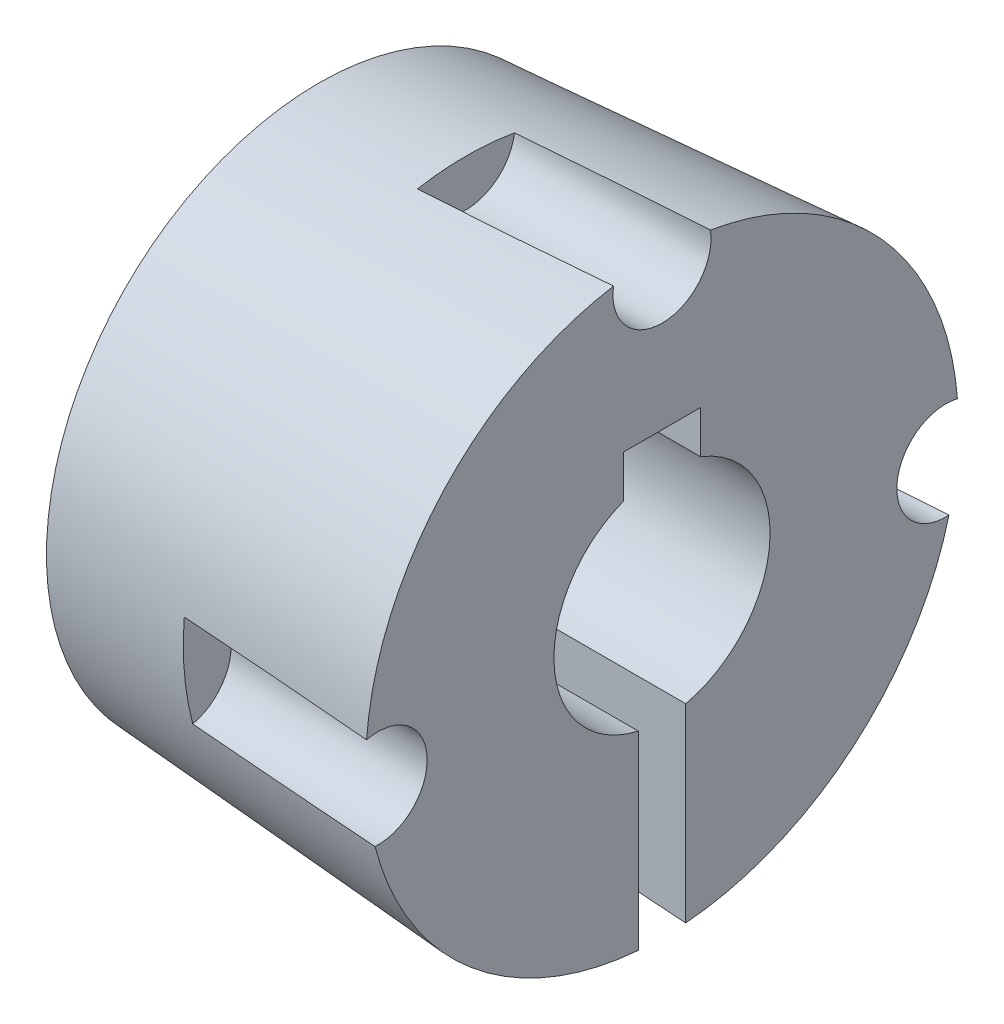
ISO-10303-21;
HEADER;
FILE_DESCRIPTION(('STEP AP214'),'2;1');
FILE_NAME('part.step','',(''),(''),'','','');
FILE_SCHEMA(('AUTOMOTIVE_DESIGN { 1 0 10303 214 1 1 1 1 }'));
ENDSEC;
DATA;
#1=APPLICATION_CONTEXT('core data for automotive mechanical design processes');
#2=APPLICATION_PROTOCOL_DEFINITION('international standard','automotive_design',2000,#1);
#3=PRODUCT_CONTEXT('',#1,'mechanical');
#4=PRODUCT('Part','Part','',(#3));
#5=PRODUCT_RELATED_PRODUCT_CATEGORY('part','',(#4));
#6=PRODUCT_DEFINITION_FORMATION('','',#4);
#7=PRODUCT_DEFINITION_CONTEXT('part definition',#1,'design');
#8=PRODUCT_DEFINITION('design','',#6,#7);
#9=PRODUCT_DEFINITION_SHAPE('','',#8);
#10=(LENGTH_UNIT() NAMED_UNIT(*) SI_UNIT(.MILLI.,.METRE.));
#11=(NAMED_UNIT(*) PLANE_ANGLE_UNIT() SI_UNIT($,.RADIAN.));
#12=(NAMED_UNIT(*) SI_UNIT($,.STERADIAN.) SOLID_ANGLE_UNIT());
#13=UNCERTAINTY_MEASURE_WITH_UNIT(LENGTH_MEASURE(1.E-05),#10,'distance_accuracy_value','');
#14=(GEOMETRIC_REPRESENTATION_CONTEXT(3) GLOBAL_UNCERTAINTY_ASSIGNED_CONTEXT((#13)) GLOBAL_UNIT_ASSIGNED_CONTEXT((#10,
#11,#12)) REPRESENTATION_CONTEXT('',''));
#15=CARTESIAN_POINT('',(0.,0.,0.));
#16=DIRECTION('',(0.,0.,1.));
#17=DIRECTION('',(1.,0.,0.));
#18=AXIS2_PLACEMENT_3D('',#15,#16,#17);
#19=CARTESIAN_POINT('',(22.225,9.59485,0.));
#20=DIRECTION('',(1.,0.,0.));
#21=DIRECTION('',(0.,-1.,0.));
#22=AXIS2_PLACEMENT_3D('',#19,#20,#21);
#23=PLANE('',#22);
#24=DIRECTION('',(0.,1.,0.));
#25=VECTOR('',#24,1.);
#26=CARTESIAN_POINT('',(22.225,-0.959485,1.535176));
#27=LINE('',#26,#25);
#28=CARTESIAN_POINT('',(22.225,-19.1281943930687,1.535176));
#29=VERTEX_POINT('',#28);
#30=CARTESIAN_POINT('',(22.225,-6.82958524721846,1.535176));
#31=VERTEX_POINT('',#30);
#32=EDGE_CURVE('E132',#29,#31,#27,.T.);
#33=ORIENTED_EDGE('',*,*,#32,.T.);
#34=CARTESIAN_POINT('',(22.225,0.,0.));
#35=DIRECTION('',(-1.,0.,0.));
#36=DIRECTION('',(0.,0.,-1.));
#37=AXIS2_PLACEMENT_3D('',#34,#35,#36);
#38=CIRCLE('',#37,7.);
#39=CARTESIAN_POINT('',(22.225,6.53834841531101,2.5));
#40=VERTEX_POINT('',#39);
#41=EDGE_CURVE('E168',#31,#40,#38,.T.);
#42=ORIENTED_EDGE('',*,*,#41,.T.);
#43=DIRECTION('',(0.,1.,0.));
#44=VECTOR('',#43,1.);
#45=CARTESIAN_POINT('',(22.225,7.122425,2.5));
#46=LINE('',#45,#44);
#47=CARTESIAN_POINT('',(22.225,9.3,2.5));
#48=VERTEX_POINT('',#47);
#49=EDGE_CURVE('E173',#40,#48,#46,.T.);
#50=ORIENTED_EDGE('',*,*,#49,.T.);
#51=DIRECTION('',(0.,0.,-1.));
#52=VECTOR('',#51,1.);
#53=CARTESIAN_POINT('',(22.225,9.3,0.));
#54=LINE('',#53,#52);
#55=CARTESIAN_POINT('',(22.225,9.3,-2.5));
#56=VERTEX_POINT('',#55);
#57=EDGE_CURVE('E11',#48,#56,#54,.T.);
#58=ORIENTED_EDGE('',*,*,#57,.T.);
#59=DIRECTION('',(0.,-1.,0.));
#60=VECTOR('',#59,1.);
#61=CARTESIAN_POINT('',(22.225,7.122425,-2.5));
#62=LINE('',#61,#60);
#63=CARTESIAN_POINT('',(22.225,6.53834841531101,-2.5));
#64=VERTEX_POINT('',#63);
#65=EDGE_CURVE('E160',#56,#64,#62,.T.);
#66=ORIENTED_EDGE('',*,*,#65,.T.);
#67=CARTESIAN_POINT('',(22.225,0.,0.));
#68=DIRECTION('',(-1.,0.,0.));
#69=DIRECTION('',(0.,0.,-1.));
#70=AXIS2_PLACEMENT_3D('',#67,#68,#69);
#71=CIRCLE('',#70,7.);
#72=CARTESIAN_POINT('',(22.225,-6.82958524721846,-1.535176));
#73=VERTEX_POINT('',#72);
#74=EDGE_CURVE('E180',#64,#73,#71,.T.);
#75=ORIENTED_EDGE('',*,*,#74,.T.);
#76=DIRECTION('',(0.,-1.,0.));
#77=VECTOR('',#76,1.);
#78=CARTESIAN_POINT('',(22.225,-0.959485,-1.535176));
#79=LINE('',#78,#77);
#80=CARTESIAN_POINT('',(22.225,-19.1281943930687,-1.535176));
#81=VERTEX_POINT('',#80);
#82=EDGE_CURVE('E166',#73,#81,#79,.T.);
#83=ORIENTED_EDGE('',*,*,#82,.T.);
#84=CARTESIAN_POINT('',(22.225,0.,0.));
#85=DIRECTION('',(-1.,0.,0.));
#86=DIRECTION('',(0.,1.,0.));
#87=AXIS2_PLACEMENT_3D('',#84,#85,#86);
#88=CIRCLE('',#87,19.1897);
#89=CARTESIAN_POINT('',(22.225,-4.77681167054719,-18.5856572752788));
#90=VERTEX_POINT('',#89);
#91=EDGE_CURVE('E218',#90,#81,#88,.T.);
#92=ORIENTED_EDGE('',*,*,#91,.F.);
#93=CARTESIAN_POINT('',(22.225,-1.60829363649681,-18.3828803833568));
#94=DIRECTION('',(-1.,0.,0.));
#95=DIRECTION('',(0.,-0.996194698091746,0.0871557427476582));
#96=AXIS2_PLACEMENT_3D('',#93,#94,#95);
#97=CIRCLE('',#96,3.175);
#98=CARTESIAN_POINT('',(22.225,1.47687565123978,-19.1327840211709));
#99=VERTEX_POINT('',#98);
#100=EDGE_CURVE('E247',#90,#99,#97,.T.);
#101=ORIENTED_EDGE('',*,*,#100,.T.);
#102=CARTESIAN_POINT('',(22.225,0.,0.));
#103=DIRECTION('',(-1.,0.,0.));
#104=DIRECTION('',(0.,1.,0.));
#105=AXIS2_PLACEMENT_3D('',#102,#103,#104);
#106=CIRCLE('',#105,19.1897);
#107=CARTESIAN_POINT('',(22.225,18.9312598072953,-3.13878769570155));
#108=VERTEX_POINT('',#107);
#109=EDGE_CURVE('E216',#108,#99,#106,.T.);
#110=ORIENTED_EDGE('',*,*,#109,.F.);
#111=CARTESIAN_POINT('',(22.225,18.4531,0.));
#112=DIRECTION('',(-1.,0.,0.));
#113=DIRECTION('',(0.,0.,-1.));
#114=AXIS2_PLACEMENT_3D('',#111,#112,#113);
#115=CIRCLE('',#114,3.175);
#116=CARTESIAN_POINT('',(22.225,18.9312598072953,3.13878769570155));
#117=VERTEX_POINT('',#116);
#118=EDGE_CURVE('E179',#108,#117,#115,.T.);
#119=ORIENTED_EDGE('',*,*,#118,.T.);
#120=CARTESIAN_POINT('',(22.225,0.,0.));
#121=DIRECTION('',(-1.,0.,0.));
#122=DIRECTION('',(0.,1.,0.));
#123=AXIS2_PLACEMENT_3D('',#120,#121,#122);
#124=CIRCLE('',#123,19.1897);
#125=CARTESIAN_POINT('',(22.225,1.47687565123978,19.1327840211709));
#126=VERTEX_POINT('',#125);
#127=EDGE_CURVE('E209',#126,#117,#124,.T.);
#128=ORIENTED_EDGE('',*,*,#127,.F.);
#129=CARTESIAN_POINT('',(22.225,-1.60829363649681,18.3828803833568));
#130=DIRECTION('',(-1.,0.,0.));
#131=DIRECTION('',(0.,0.996194698091746,0.0871557427476582));
#132=AXIS2_PLACEMENT_3D('',#129,#130,#131);
#133=CIRCLE('',#132,3.175);
#134=CARTESIAN_POINT('',(22.225,-4.77681167054719,18.5856572752788));
#135=VERTEX_POINT('',#134);
#136=EDGE_CURVE('E135',#126,#135,#133,.T.);
#137=ORIENTED_EDGE('',*,*,#136,.T.);
#138=CARTESIAN_POINT('',(22.225,0.,0.));
#139=DIRECTION('',(-1.,0.,0.));
#140=DIRECTION('',(0.,1.,0.));
#141=AXIS2_PLACEMENT_3D('',#138,#139,#140);
#142=CIRCLE('',#141,19.1897);
#143=EDGE_CURVE('E129',#29,#135,#142,.T.);
#144=ORIENTED_EDGE('',*,*,#143,.F.);
#145=EDGE_LOOP('',(#33,#42,#50,#58,#66,#75,#83,#92,#101,#110,#119,#128,#137,#144));
#146=FACE_BOUND('',#145,.T.);
#147=ADVANCED_FACE('F19',(#146),#23,.T.);
#148=CARTESIAN_POINT('',(11.1125,9.3,0.));
#149=DIRECTION('',(0.,-1.,0.));
#150=DIRECTION('',(0.,0.,-1.));
#151=AXIS2_PLACEMENT_3D('',#148,#149,#150);
#152=PLANE('',#151);
#153=DIRECTION('',(0.,0.,1.));
#154=VECTOR('',#153,1.);
#155=CARTESIAN_POINT('',(0.,9.3,0.));
#156=LINE('',#155,#154);
#157=CARTESIAN_POINT('',(0.,9.3,-2.5));
#158=VERTEX_POINT('',#157);
#159=CARTESIAN_POINT('',(0.,9.3,2.5));
#160=VERTEX_POINT('',#159);
#161=EDGE_CURVE('E176',#158,#160,#156,.T.);
#162=ORIENTED_EDGE('',*,*,#161,.F.);
#163=DIRECTION('',(1.,0.,0.));
#164=VECTOR('',#163,1.);
#165=CARTESIAN_POINT('',(11.1125,9.3,-2.5));
#166=LINE('',#165,#164);
#167=EDGE_CURVE('E31',#158,#56,#166,.T.);
#168=ORIENTED_EDGE('',*,*,#167,.T.);
#169=ORIENTED_EDGE('',*,*,#57,.F.);
#170=DIRECTION('',(-1.,0.,0.));
#171=VECTOR('',#170,1.);
#172=CARTESIAN_POINT('',(11.1125,9.3,2.5));
#173=LINE('',#172,#171);
#174=EDGE_CURVE('E177',#48,#160,#173,.T.);
#175=ORIENTED_EDGE('',*,*,#174,.T.);
#176=EDGE_LOOP('',(#162,#168,#169,#175));
#177=FACE_BOUND('',#176,.T.);
#178=ADVANCED_FACE('F371',(#177),#152,.T.);
#179=CARTESIAN_POINT('',(11.1125,4.65,-2.5));
#180=DIRECTION('',(0.,0.,1.));
#181=DIRECTION('',(1.,0.,0.));
#182=AXIS2_PLACEMENT_3D('',#179,#180,#181);
#183=PLANE('',#182);
#184=DIRECTION('',(0.,1.,0.));
#185=VECTOR('',#184,1.);
#186=CARTESIAN_POINT('',(0.,6.73452557374426,-2.5));
#187=LINE('',#186,#185);
#188=CARTESIAN_POINT('',(0.,6.53834841531101,-2.5));
#189=VERTEX_POINT('',#188);
#190=EDGE_CURVE('E163',#189,#158,#187,.T.);
#191=ORIENTED_EDGE('',*,*,#190,.F.);
#192=DIRECTION('',(-1.,0.,0.));
#193=VECTOR('',#192,1.);
#194=CARTESIAN_POINT('',(11.1125,6.53834841531101,-2.5));
#195=LINE('',#194,#193);
#196=EDGE_CURVE('E98',#64,#189,#195,.T.);
#197=ORIENTED_EDGE('',*,*,#196,.F.);
#198=ORIENTED_EDGE('',*,*,#65,.F.);
#199=ORIENTED_EDGE('',*,*,#167,.F.);
#200=EDGE_LOOP('',(#191,#197,#198,#199));
#201=FACE_BOUND('',#200,.T.);
#202=ADVANCED_FACE('F376',(#201),#183,.T.);
#203=CARTESIAN_POINT('',(11.1125,4.65,2.5));
#204=DIRECTION('',(0.,0.,1.));
#205=DIRECTION('',(1.,0.,0.));
#206=AXIS2_PLACEMENT_3D('',#203,#204,#205);
#207=PLANE('',#206);
#208=DIRECTION('',(0.,-1.,0.));
#209=VECTOR('',#208,1.);
#210=CARTESIAN_POINT('',(0.,6.73452557374426,2.5));
#211=LINE('',#210,#209);
#212=CARTESIAN_POINT('',(0.,6.53834841531101,2.5));
#213=VERTEX_POINT('',#212);
#214=EDGE_CURVE('E188',#160,#213,#211,.T.);
#215=ORIENTED_EDGE('',*,*,#214,.F.);
#216=ORIENTED_EDGE('',*,*,#174,.F.);
#217=ORIENTED_EDGE('',*,*,#49,.F.);
#218=DIRECTION('',(1.,0.,0.));
#219=VECTOR('',#218,1.);
#220=CARTESIAN_POINT('',(11.1125,6.53834841531101,2.5));
#221=LINE('',#220,#219);
#222=EDGE_CURVE('E171',#213,#40,#221,.T.);
#223=ORIENTED_EDGE('',*,*,#222,.F.);
#224=EDGE_LOOP('',(#215,#216,#217,#223));
#225=FACE_BOUND('',#224,.T.);
#226=ADVANCED_FACE('F350',(#225),#207,.F.);
#227=CARTESIAN_POINT('',(16.375,18.4531,0.));
#228=DIRECTION('',(-1.,0.,0.));
#229=DIRECTION('',(0.,0.,-1.));
#230=AXIS2_PLACEMENT_3D('',#227,#228,#229);
#231=CYLINDRICAL_SURFACE('',#230,3.175);
#232=CARTESIAN_POINT('',(22.2249990842214,18.9312663694617,3.13874772556863));
#233=CARTESIAN_POINT('',(21.6965128717116,18.8929039142587,3.14455795965913));
#234=CARTESIAN_POINT('',(21.1680111110432,18.8546480942142,3.14965156892552));
#235=CARTESIAN_POINT('',(20.110817453753,18.7783407807485,3.15843144485977));
#236=CARTESIAN_POINT('',(19.5821255487172,18.7402893539092,3.1621172774578));
#237=CARTESIAN_POINT('',(18.5245516279835,18.6643935701948,3.16810490022839));
#238=CARTESIAN_POINT('',(17.995669604871,18.6265492823395,3.1704062539587));
#239=CARTESIAN_POINT('',(16.9377154395597,18.5510693455787,3.17364806457086));
#240=CARTESIAN_POINT('',(16.4086432909538,18.5134337677394,3.17458808323553));
#241=CARTESIAN_POINT('',(15.3503088758068,18.4383720006973,3.17513025511628));
#242=CARTESIAN_POINT('',(14.8210466038835,18.4009458843075,3.17473196892807));
#243=CARTESIAN_POINT('',(13.7623319385705,18.3263028869355,3.17262043290532));
#244=CARTESIAN_POINT('',(13.2328795408319,18.2890860801693,3.17090674304027));
#245=CARTESIAN_POINT('',(12.1737846294268,18.2148607661589,3.16618718775157));
#246=CARTESIAN_POINT('',(11.6441421124536,18.1778523342146,3.1631808822157));
#247=CARTESIAN_POINT('',(10.5846669364506,18.104041794008,3.15589872208468));
#248=CARTESIAN_POINT('',(10.0548342751476,18.0672397617076,3.15162242780242));
#249=CARTESIAN_POINT('',(9.52499991031494,18.0305463707409,3.14672354499309));
#250=B_SPLINE_CURVE_WITH_KNOTS('',3,(#232,#233,#234,#235,#236,#237,#238,#239,#240,#241,#242,
#243,#244,#245,#246,#247,#248,#249),.UNSPECIFIED.,.F.,.F.,(4,2,2,2,2,2,2,2,4),(0.,
1.5897251702087,3.17994011676524,4.77065609934622,6.36188402365459,7.95363444524772,
9.54591757338986,11.1387432749278,12.7321210781888),.UNSPECIFIED.);
#251=CARTESIAN_POINT('',(9.525,18.0305408396218,3.14675527424369));
#252=VERTEX_POINT('',#251);
#253=EDGE_CURVE('E212',#117,#252,#250,.T.);
#254=ORIENTED_EDGE('',*,*,#253,.F.);
#255=ORIENTED_EDGE('',*,*,#118,.F.);
#256=CARTESIAN_POINT('',(9.52499991031494,18.0305463707409,-3.14672354499308));
#257=CARTESIAN_POINT('',(10.0548342751476,18.0672397617076,-3.15162242780242));
#258=CARTESIAN_POINT('',(10.5846669364506,18.104041794008,-3.15589872208468));
#259=CARTESIAN_POINT('',(11.6441421124535,18.1778523342145,-3.16318088221571));
#260=CARTESIAN_POINT('',(12.1737846294267,18.2148607661589,-3.16618718775157));
#261=CARTESIAN_POINT('',(13.2328795408318,18.2890860801693,-3.17090674304027));
#262=CARTESIAN_POINT('',(13.7623319385704,18.3263028869355,-3.17262043290533));
#263=CARTESIAN_POINT('',(14.8210466038834,18.4009458843075,-3.17473196892808));
#264=CARTESIAN_POINT('',(15.3503088758067,18.4383720006973,-3.17513025511628));
#265=CARTESIAN_POINT('',(16.4086432909537,18.5134337677394,-3.17458808323554));
#266=CARTESIAN_POINT('',(16.9377154395596,18.5510693455787,-3.17364806457086));
#267=CARTESIAN_POINT('',(17.9956696048709,18.6265492823395,-3.1704062539587));
#268=CARTESIAN_POINT('',(18.5245516279834,18.6643935701948,-3.16810490022839));
#269=CARTESIAN_POINT('',(19.5821255487171,18.7402893539092,-3.16211727745779));
#270=CARTESIAN_POINT('',(20.110817453753,18.7783407807485,-3.15843144485975));
#271=CARTESIAN_POINT('',(21.1680111110432,18.8546480942142,-3.14965156892549));
#272=CARTESIAN_POINT('',(21.6965128717116,18.8929039142587,-3.14455795965909));
#273=CARTESIAN_POINT('',(22.2249990842214,18.9312663694617,-3.1387477255686));
#274=B_SPLINE_CURVE_WITH_KNOTS('',3,(#256,#257,#258,#259,#260,#261,#262,#263,#264,#265,#266,
#267,#268,#269,#270,#271,#272,#273),.UNSPECIFIED.,.F.,.F.,(4,2,2,2,2,2,2,2,4),(0.,
1.59337780326089,3.18620350479883,4.77848663294095,6.37023705453407,7.96146497884245,
9.55218096142345,11.14239590798,12.7321210781888),.UNSPECIFIED.);
#275=CARTESIAN_POINT('',(9.525,18.0305408396218,-3.14675527424369));
#276=VERTEX_POINT('',#275);
#277=EDGE_CURVE('E219',#276,#108,#274,.T.);
#278=ORIENTED_EDGE('',*,*,#277,.F.);
#279=CARTESIAN_POINT('',(9.525,18.4531,0.));
#280=DIRECTION('',(-1.,0.,0.));
#281=DIRECTION('',(0.,0.,-1.));
#282=AXIS2_PLACEMENT_3D('',#279,#280,#281);
#283=CIRCLE('',#282,3.175);
#284=EDGE_CURVE('E206',#276,#252,#283,.T.);
#285=ORIENTED_EDGE('',*,*,#284,.T.);
#286=EDGE_LOOP('',(#254,#255,#278,#285));
#287=FACE_BOUND('',#286,.T.);
#288=ADVANCED_FACE('F380',(#287),#231,.F.);
#289=CARTESIAN_POINT('',(9.525,18.4531,0.));
#290=DIRECTION('',(-1.,0.,0.));
#291=DIRECTION('',(0.,0.,1.));
#292=AXIS2_PLACEMENT_3D('',#289,#290,#291);
#293=PLANE('',#292);
#294=CARTESIAN_POINT('',(9.525,0.,0.));
#295=DIRECTION('',(-1.,0.,0.));
#296=DIRECTION('',(0.,1.,0.));
#297=AXIS2_PLACEMENT_3D('',#294,#295,#296);
#298=CIRCLE('',#297,18.3030727399869);
#299=EDGE_CURVE('E225',#252,#276,#298,.T.);
#300=ORIENTED_EDGE('',*,*,#299,.F.);
#301=ORIENTED_EDGE('',*,*,#284,.F.);
#302=EDGE_LOOP('',(#300,#301));
#303=FACE_BOUND('',#302,.T.);
#304=ADVANCED_FACE('F347',(#303),#293,.F.);
#305=CARTESIAN_POINT('',(16.375,-1.60829363649681,18.3828803833568));
#306=DIRECTION('',(-1.,0.,0.));
#307=DIRECTION('',(0.,0.996194698091746,0.0871557427476582));
#308=AXIS2_PLACEMENT_3D('',#305,#306,#307);
#309=CYLINDRICAL_SURFACE('',#308,3.175);
#310=CARTESIAN_POINT('',(22.224999083807,-4.77677240666845,18.5856673006393));
#311=CARTESIAN_POINT('',(21.6965126218974,-4.77921701984449,18.5469444136844));
#312=CARTESIAN_POINT('',(21.168010611849,-4.78095702968703,18.5083902139069));
#313=CARTESIAN_POINT('',(20.1108165270524,-4.78305287102237,18.431608026402));
#314=CARTESIAN_POINT('',(19.5821244438938,-4.78340827608722,18.3933801427891));
#315=CARTESIAN_POINT('',(18.5245502381681,-4.78275835851104,18.3172512897642));
#316=CARTESIAN_POINT('',(17.9956681081893,-4.7817526072878,18.2793504271021));
#317=CARTESIAN_POINT('',(16.9377138003996,-4.77840357141758,18.2038751617185));
#318=CARTESIAN_POINT('',(16.4086416161842,-4.77605985659523,18.1663008679402));
#319=CARTESIAN_POINT('',(15.3503072010726,-4.77005790265254,18.0914774798347));
#320=CARTESIAN_POINT('',(14.8210449647963,-4.76639923232316,18.0542284962944));
#321=CARTESIAN_POINT('',(13.7623304420325,-4.75779016868792,17.9800535799917));
#322=CARTESIAN_POINT('',(13.2328781511978,-4.75283934366817,17.9431277594688));
#323=CARTESIAN_POINT('',(12.1737835248556,-4.74166859047176,17.8695962507612));
#324=CARTESIAN_POINT('',(11.6441411860428,-4.73544823059099,17.8329906759032));
#325=CARTESIAN_POINT('',(10.5846664376171,-4.72176077587834,17.7600957181726));
#326=CARTESIAN_POINT('',(10.0548340257317,-4.71429324982028,17.7238064492497));
#327=CARTESIAN_POINT('',(9.52499991031484,-4.70621497294034,17.6876796704521));
#328=B_SPLINE_CURVE_WITH_KNOTS('',3,(#310,#311,#312,#313,#314,#315,#316,#317,#318,#319,#320,
#321,#322,#323,#324,#325,#326,#327),.UNSPECIFIED.,.F.,.F.,(4,2,2,2,2,2,2,2,4),(0.,
1.58972592013486,3.17994140236498,4.7706577063495,6.36188573777791,7.95363605219798,
9.54591885886816,11.1387440246332,12.7321210778216),.UNSPECIFIED.);
#329=CARTESIAN_POINT('',(9.525,-4.70624609941303,17.6876713949862));
#330=VERTEX_POINT('',#329);
#331=EDGE_CURVE('E138',#135,#330,#328,.T.);
#332=ORIENTED_EDGE('',*,*,#331,.F.);
#333=ORIENTED_EDGE('',*,*,#136,.F.);
#334=CARTESIAN_POINT('',(9.52499991031484,1.56328365076338,18.2361897260175));
#335=CARTESIAN_POINT('',(10.0548340257317,1.56496585116255,18.2731704359277));
#336=CARTESIAN_POINT('',(10.5846664376171,1.56601836330302,18.3102051116057));
#337=CARTESIAN_POINT('',(11.6441411860428,1.56683979825201,18.3843694327021));
#338=CARTESIAN_POINT('',(12.1737835248557,1.56660916552258,18.4214990407834));
#339=CARTESIAN_POINT('',(13.2328781511979,1.56484159738921,18.4958532215851));
#340=CARTESIAN_POINT('',(13.7623304420326,1.56330510680982,18.533077757665));
#341=CARTESIAN_POINT('',(14.8210449647964,1.55890304037942,18.6076207385307));
#342=CARTESIAN_POINT('',(15.3503072010726,1.55603790917379,18.6449391477483));
#343=CARTESIAN_POINT('',(16.4086416161842,1.54895573495838,18.7196680288259));
#344=CARTESIAN_POINT('',(16.9377138003996,1.54473913584455,18.7570784664606));
#345=CARTESIAN_POINT('',(17.9956681081893,1.53493115004186,18.8319886469468));
#346=CARTESIAN_POINT('',(18.5245502381681,1.52934020591084,18.8694883572094));
#347=CARTESIAN_POINT('',(19.5821244438939,1.51676061318303,18.944573498899));
#348=CARTESIAN_POINT('',(20.1108165270524,1.50977240519426,18.9821588996204));
#349=CARTESIAN_POINT('',(21.168010611849,1.49437531746062,19.0574106541399));
#350=CARTESIAN_POINT('',(21.6965126218974,1.48596687574461,19.0950769794536));
#351=CARTESIAN_POINT('',(22.224999083807,1.476835242982,19.1327870761227));
#352=B_SPLINE_CURVE_WITH_KNOTS('',3,(#334,#335,#336,#337,#338,#339,#340,#341,#342,#343,#344,
#345,#346,#347,#348,#349,#350,#351),.UNSPECIFIED.,.F.,.F.,(4,2,2,2,2,2,2,2,4),(0.,
1.59337705318845,3.18620221895346,4.77848502562364,6.37023534004371,7.96146337147212,
9.55217967545664,11.1423951576867,12.7321210778216),.UNSPECIFIED.);
#353=CARTESIAN_POINT('',(9.525,1.56331574137458,18.2361869813297));
#354=VERTEX_POINT('',#353);
#355=EDGE_CURVE('E213',#354,#126,#352,.T.);
#356=ORIENTED_EDGE('',*,*,#355,.F.);
#357=CARTESIAN_POINT('',(9.525,-1.60829363649681,18.3828803833568));
#358=DIRECTION('',(-1.,0.,0.));
#359=DIRECTION('',(0.,0.996194698091746,0.0871557427476582));
#360=AXIS2_PLACEMENT_3D('',#357,#358,#359);
#361=CIRCLE('',#360,3.175);
#362=EDGE_CURVE('E231',#354,#330,#361,.T.);
#363=ORIENTED_EDGE('',*,*,#362,.T.);
#364=EDGE_LOOP('',(#332,#333,#356,#363));
#365=FACE_BOUND('',#364,.T.);
#366=ADVANCED_FACE('F337',(#365),#309,.F.);
#367=CARTESIAN_POINT('',(9.525,-1.60829363649681,18.3828803833568));
#368=DIRECTION('',(-1.,0.,0.));
#369=DIRECTION('',(0.,-0.996194698091746,-0.0871557427476582));
#370=AXIS2_PLACEMENT_3D('',#367,#368,#369);
#371=PLANE('',#370);
#372=CARTESIAN_POINT('',(9.525,0.,0.));
#373=DIRECTION('',(-1.,0.,0.));
#374=DIRECTION('',(0.,1.,0.));
#375=AXIS2_PLACEMENT_3D('',#372,#373,#374);
#376=CIRCLE('',#375,18.3030727399869);
#377=EDGE_CURVE('E239',#330,#354,#376,.T.);
#378=ORIENTED_EDGE('',*,*,#377,.F.);
#379=ORIENTED_EDGE('',*,*,#362,.F.);
#380=EDGE_LOOP('',(#378,#379));
#381=FACE_BOUND('',#380,.T.);
#382=ADVANCED_FACE('F268',(#381),#371,.F.);
#383=CARTESIAN_POINT('',(11.1125,0.,0.));
#384=DIRECTION('',(1.,0.,0.));
#385=DIRECTION('',(0.,1.,0.));
#386=AXIS2_PLACEMENT_3D('',#383,#384,#385);
#387=CONICAL_SURFACE('',#386,18.4139011474885,0.0697000802996132);
#388=CARTESIAN_POINT('',(0.,-17.5711663590411,1.535176));
#389=CARTESIAN_POINT('',(10.641160729511,-18.3168895142304,1.535176));
#390=CARTESIAN_POINT('',(22.2252706108045,-19.1282133460135,1.535176));
#391=(BOUNDED_CURVE() B_SPLINE_CURVE(2,(#388,#389,#390),.UNSPECIFIED.,.F.,
.F.) B_SPLINE_CURVE_WITH_KNOTS((3,3),(0.,22.2797452655061),
.UNSPECIFIED.) CURVE() GEOMETRIC_REPRESENTATION_ITEM() RATIONAL_B_SPLINE_CURVE((1.,
1.00089494617182,1.)) REPRESENTATION_ITEM(''));
#392=CARTESIAN_POINT('',(0.,-17.5711663590411,1.535176));
#393=VERTEX_POINT('',#392);
#394=EDGE_CURVE('E145',#393,#29,#391,.T.);
#395=ORIENTED_EDGE('',*,*,#394,.T.);
#396=ORIENTED_EDGE('',*,*,#143,.T.);
#397=ORIENTED_EDGE('',*,*,#331,.T.);
#398=ORIENTED_EDGE('',*,*,#377,.T.);
#399=ORIENTED_EDGE('',*,*,#355,.T.);
#400=ORIENTED_EDGE('',*,*,#127,.T.);
#401=ORIENTED_EDGE('',*,*,#253,.T.);
#402=ORIENTED_EDGE('',*,*,#299,.T.);
#403=ORIENTED_EDGE('',*,*,#277,.T.);
#404=ORIENTED_EDGE('',*,*,#109,.T.);
#405=CARTESIAN_POINT('',(22.224999083807,1.47683524298161,-19.1327870761228));
#406=CARTESIAN_POINT('',(21.6965126218914,1.48596687574423,-19.0950769794532));
#407=CARTESIAN_POINT('',(21.1680106118368,1.49437531746026,-19.0574106541391));
#408=CARTESIAN_POINT('',(20.1108165270298,1.50977240519392,-18.9821588996188));
#409=CARTESIAN_POINT('',(19.5821244438669,1.5167606131827,-18.9445734988971));
#410=CARTESIAN_POINT('',(18.5245502381343,1.52934020591055,-18.8694883572071));
#411=CARTESIAN_POINT('',(17.9956681081529,1.53493115004159,-18.8319886469443));
#412=CARTESIAN_POINT('',(16.9377138003597,1.54473913584431,-18.7570784664578));
#413=CARTESIAN_POINT('',(16.4086416161434,1.54895573495815,-18.719668028823));
#414=CARTESIAN_POINT('',(15.3503072010318,1.55603790917359,-18.6449391477455));
#415=CARTESIAN_POINT('',(14.8210449647564,1.55890304037922,-18.6076207385279));
#416=CARTESIAN_POINT('',(13.7623304419961,1.56330510680966,-18.5330777576625));
#417=CARTESIAN_POINT('',(13.232878151164,1.56484159738907,-18.4958532215827));
#418=CARTESIAN_POINT('',(12.1737835248287,1.56660916552247,-18.4214990407815));
#419=CARTESIAN_POINT('',(11.6441411860202,1.56683979825192,-18.3843694327005));
#420=CARTESIAN_POINT('',(10.5846664376049,1.56601836330295,-18.3102051116049));
#421=CARTESIAN_POINT('',(10.0548340257256,1.5649658511625,-18.2731704359273));
#422=CARTESIAN_POINT('',(9.52499991031484,1.56328365076337,-18.2361897260175));
#423=B_SPLINE_CURVE_WITH_KNOTS('',3,(#405,#406,#407,#408,#409,#410,#411,#412,#413,#414,#415,
#416,#417,#418,#419,#420,#421,#422),.UNSPECIFIED.,.F.,.F.,(4,2,2,2,2,2,2,2,4),(0.,
1.58972592015313,3.17994140239629,4.77065770638865,6.36188573781966,7.95363605223712,
9.54591885889948,11.1387440246514,12.7321210778216),.UNSPECIFIED.);
#424=CARTESIAN_POINT('',(9.525,1.56331574137458,-18.2361869813297));
#425=VERTEX_POINT('',#424);
#426=EDGE_CURVE('E250',#99,#425,#423,.T.);
#427=ORIENTED_EDGE('',*,*,#426,.T.);
#428=CARTESIAN_POINT('',(9.525,0.,0.));
#429=DIRECTION('',(-1.,0.,0.));
#430=DIRECTION('',(0.,1.,0.));
#431=AXIS2_PLACEMENT_3D('',#428,#429,#430);
#432=CIRCLE('',#431,18.3030727399869);
#433=CARTESIAN_POINT('',(9.525,-4.70624609941303,-17.6876713949862));
#434=VERTEX_POINT('',#433);
#435=EDGE_CURVE('E170',#425,#434,#432,.T.);
#436=ORIENTED_EDGE('',*,*,#435,.T.);
#437=CARTESIAN_POINT('',(9.52499991031484,-4.70621497294038,-17.6876796704521));
#438=CARTESIAN_POINT('',(10.0548340257256,-4.71429324982022,-17.7238064492493));
#439=CARTESIAN_POINT('',(10.5846664376048,-4.72176077587817,-17.7600957181717));
#440=CARTESIAN_POINT('',(11.6441411860201,-4.73544823059067,-17.8329906759017));
#441=CARTESIAN_POINT('',(12.1737835248285,-4.74166859047136,-17.8695962507593));
#442=CARTESIAN_POINT('',(13.2328781511637,-4.75283934366764,-17.9431277594665));
#443=CARTESIAN_POINT('',(13.7623304419958,-4.75779016868733,-17.9800535799892));
#444=CARTESIAN_POINT('',(14.8210449647561,-4.76639923232249,-18.0542284962917));
#445=CARTESIAN_POINT('',(15.3503072010315,-4.77005790265185,-18.0914774798319));
#446=CARTESIAN_POINT('',(16.4086416161431,-4.7760598565945,-18.1663008679374));
#447=CARTESIAN_POINT('',(16.9377138003593,-4.77840357141683,-18.2038751617158));
#448=CARTESIAN_POINT('',(17.9956681081526,-4.78175260728704,-18.2793504270997));
#449=CARTESIAN_POINT('',(18.524550238134,-4.78275835851029,-18.317251289762));
#450=CARTESIAN_POINT('',(19.5821244438667,-4.78340827608652,-18.3933801427874));
#451=CARTESIAN_POINT('',(20.1108165270296,-4.78305287102172,-18.4316080264006));
#452=CARTESIAN_POINT('',(21.1680106118367,-4.78095702968649,-18.5083902139062));
#453=CARTESIAN_POINT('',(21.6965126218913,-4.77921701984401,-18.5469444136841));
#454=CARTESIAN_POINT('',(22.224999083807,-4.77677240666801,-18.5856673006394));
#455=B_SPLINE_CURVE_WITH_KNOTS('',3,(#437,#438,#439,#440,#441,#442,#443,#444,#445,#446,#447,
#448,#449,#450,#451,#452,#453,#454),.UNSPECIFIED.,.F.,.F.,(4,2,2,2,2,2,2,2,4),(0.,
1.59337705317002,3.18620221892187,4.77848502558416,6.3702353400016,7.96146337143264,
9.55217967542506,11.1423951576683,12.7321210778216),.UNSPECIFIED.);
#456=EDGE_CURVE('E139',#434,#90,#455,.T.);
#457=ORIENTED_EDGE('',*,*,#456,.T.);
#458=ORIENTED_EDGE('',*,*,#91,.T.);
#459=CARTESIAN_POINT('',(22.2252706108045,-19.1282133460135,-1.535176));
#460=CARTESIAN_POINT('',(10.641160729511,-18.3168895142304,-1.535176));
#461=CARTESIAN_POINT('',(0.,-17.5711663590411,-1.535176));
#462=(BOUNDED_CURVE() B_SPLINE_CURVE(2,(#459,#460,#461),.UNSPECIFIED.,.F.,
.F.) B_SPLINE_CURVE_WITH_KNOTS((3,3),(0.,22.2797452655061),
.UNSPECIFIED.) CURVE() GEOMETRIC_REPRESENTATION_ITEM() RATIONAL_B_SPLINE_CURVE((1.,
1.00089494617544,1.)) REPRESENTATION_ITEM(''));
#463=CARTESIAN_POINT('',(0.,-17.5711663590411,-1.535176));
#464=VERTEX_POINT('',#463);
#465=EDGE_CURVE('E148',#81,#464,#462,.T.);
#466=ORIENTED_EDGE('',*,*,#465,.T.);
#467=CARTESIAN_POINT('',(0.,0.,0.));
#468=DIRECTION('',(-1.,0.,0.));
#469=DIRECTION('',(0.,1.,0.));
#470=AXIS2_PLACEMENT_3D('',#467,#468,#469);
#471=CIRCLE('',#470,17.638102294977);
#472=EDGE_CURVE('E124',#393,#464,#471,.T.);
#473=ORIENTED_EDGE('',*,*,#472,.F.);
#474=EDGE_LOOP('',(#395,#396,#397,#398,#399,#400,#401,#402,#403,#404,#427,#436,#457,#458,#466,#473));
#475=FACE_BOUND('',#474,.T.);
#476=ADVANCED_FACE('F150',(#475),#387,.T.);
#477=CARTESIAN_POINT('',(16.375,-1.60829363649681,-18.3828803833568));
#478=DIRECTION('',(-1.,0.,0.));
#479=DIRECTION('',(0.,-0.996194698091746,0.0871557427476582));
#480=AXIS2_PLACEMENT_3D('',#477,#478,#479);
#481=CYLINDRICAL_SURFACE('',#480,3.175);
#482=ORIENTED_EDGE('',*,*,#426,.F.);
#483=ORIENTED_EDGE('',*,*,#100,.F.);
#484=ORIENTED_EDGE('',*,*,#456,.F.);
#485=CARTESIAN_POINT('',(9.525,-1.60829363649681,-18.3828803833568));
#486=DIRECTION('',(-1.,0.,0.));
#487=DIRECTION('',(0.,-0.996194698091746,0.0871557427476582));
#488=AXIS2_PLACEMENT_3D('',#485,#486,#487);
#489=CIRCLE('',#488,3.175);
#490=EDGE_CURVE('E326',#434,#425,#489,.T.);
#491=ORIENTED_EDGE('',*,*,#490,.T.);
#492=EDGE_LOOP('',(#482,#483,#484,#491));
#493=FACE_BOUND('',#492,.T.);
#494=ADVANCED_FACE('F21',(#493),#481,.F.);
#495=CARTESIAN_POINT('',(9.525,-1.60829363649681,-18.3828803833568));
#496=DIRECTION('',(-1.,0.,0.));
#497=DIRECTION('',(0.,0.996194698091746,-0.0871557427476582));
#498=AXIS2_PLACEMENT_3D('',#495,#496,#497);
#499=PLANE('',#498);
#500=ORIENTED_EDGE('',*,*,#435,.F.);
#501=ORIENTED_EDGE('',*,*,#490,.F.);
#502=EDGE_LOOP('',(#500,#501));
#503=FACE_BOUND('',#502,.T.);
#504=ADVANCED_FACE('F383',(#503),#499,.F.);
#505=CARTESIAN_POINT('',(11.1125,0.,0.));
#506=DIRECTION('',(-1.,0.,0.));
#507=DIRECTION('',(0.,0.,-1.));
#508=AXIS2_PLACEMENT_3D('',#505,#506,#507);
#509=CYLINDRICAL_SURFACE('',#508,7.);
#510=DIRECTION('',(-1.,0.,0.));
#511=VECTOR('',#510,1.);
#512=CARTESIAN_POINT('',(11.1125,-6.82958524721846,1.535176));
#513=LINE('',#512,#511);
#514=CARTESIAN_POINT('',(0.,-6.82958524721846,1.535176));
#515=VERTEX_POINT('',#514);
#516=EDGE_CURVE('E147',#31,#515,#513,.T.);
#517=ORIENTED_EDGE('',*,*,#516,.T.);
#518=CARTESIAN_POINT('',(0.,0.,0.));
#519=DIRECTION('',(1.,0.,0.));
#520=DIRECTION('',(0.,0.,-1.));
#521=AXIS2_PLACEMENT_3D('',#518,#519,#520);
#522=CIRCLE('',#521,7.);
#523=EDGE_CURVE('E182',#213,#515,#522,.T.);
#524=ORIENTED_EDGE('',*,*,#523,.F.);
#525=ORIENTED_EDGE('',*,*,#222,.T.);
#526=ORIENTED_EDGE('',*,*,#41,.F.);
#527=EDGE_LOOP('',(#517,#524,#525,#526));
#528=FACE_BOUND('',#527,.T.);
#529=ADVANCED_FACE('F386',(#528),#509,.F.);
#530=CARTESIAN_POINT('',(11.1125,0.,0.));
#531=DIRECTION('',(-1.,0.,0.));
#532=DIRECTION('',(0.,0.,-1.));
#533=AXIS2_PLACEMENT_3D('',#530,#531,#532);
#534=CYLINDRICAL_SURFACE('',#533,7.);
#535=DIRECTION('',(1.,0.,0.));
#536=VECTOR('',#535,1.);
#537=CARTESIAN_POINT('',(11.1125,-6.82958524721846,-1.535176));
#538=LINE('',#537,#536);
#539=CARTESIAN_POINT('',(0.,-6.82958524721846,-1.535176));
#540=VERTEX_POINT('',#539);
#541=EDGE_CURVE('E164',#540,#73,#538,.T.);
#542=ORIENTED_EDGE('',*,*,#541,.T.);
#543=ORIENTED_EDGE('',*,*,#74,.F.);
#544=ORIENTED_EDGE('',*,*,#196,.T.);
#545=CARTESIAN_POINT('',(0.,0.,0.));
#546=DIRECTION('',(1.,0.,0.));
#547=DIRECTION('',(0.,0.,-1.));
#548=AXIS2_PLACEMENT_3D('',#545,#546,#547);
#549=CIRCLE('',#548,7.);
#550=EDGE_CURVE('E103',#540,#189,#549,.T.);
#551=ORIENTED_EDGE('',*,*,#550,.F.);
#552=EDGE_LOOP('',(#542,#543,#544,#551));
#553=FACE_BOUND('',#552,.T.);
#554=ADVANCED_FACE('F391',(#553),#534,.F.);
#555=CARTESIAN_POINT('',(0.,8.81905114748852,0.));
#556=DIRECTION('',(-1.,0.,0.));
#557=DIRECTION('',(0.,1.,0.));
#558=AXIS2_PLACEMENT_3D('',#555,#556,#557);
#559=PLANE('',#558);
#560=DIRECTION('',(0.,-1.,0.));
#561=VECTOR('',#560,1.);
#562=CARTESIAN_POINT('',(0.,-1.34738442625574,1.535176));
#563=LINE('',#562,#561);
#564=EDGE_CURVE('E151',#515,#393,#563,.T.);
#565=ORIENTED_EDGE('',*,*,#564,.T.);
#566=ORIENTED_EDGE('',*,*,#472,.T.);
#567=DIRECTION('',(0.,1.,0.));
#568=VECTOR('',#567,1.);
#569=CARTESIAN_POINT('',(0.,-1.34738442625574,-1.535176));
#570=LINE('',#569,#568);
#571=EDGE_CURVE('E165',#464,#540,#570,.T.);
#572=ORIENTED_EDGE('',*,*,#571,.T.);
#573=ORIENTED_EDGE('',*,*,#550,.T.);
#574=ORIENTED_EDGE('',*,*,#190,.T.);
#575=ORIENTED_EDGE('',*,*,#161,.T.);
#576=ORIENTED_EDGE('',*,*,#214,.T.);
#577=ORIENTED_EDGE('',*,*,#523,.T.);
#578=EDGE_LOOP('',(#565,#566,#572,#573,#574,#575,#576,#577));
#579=FACE_BOUND('',#578,.T.);
#580=ADVANCED_FACE('F269',(#579),#559,.T.);
#581=CARTESIAN_POINT('',(11.1125,-11.51382,-1.535176));
#582=DIRECTION('',(0.,0.,1.));
#583=DIRECTION('',(1.,0.,0.));
#584=AXIS2_PLACEMENT_3D('',#581,#582,#583);
#585=PLANE('',#584);
#586=ORIENTED_EDGE('',*,*,#465,.F.);
#587=ORIENTED_EDGE('',*,*,#82,.F.);
#588=ORIENTED_EDGE('',*,*,#541,.F.);
#589=ORIENTED_EDGE('',*,*,#571,.F.);
#590=EDGE_LOOP('',(#586,#587,#588,#589));
#591=FACE_BOUND('',#590,.T.);
#592=ADVANCED_FACE('F389',(#591),#585,.T.);
#593=CARTESIAN_POINT('',(11.1125,-11.51382,1.535176));
#594=DIRECTION('',(0.,0.,1.));
#595=DIRECTION('',(1.,0.,0.));
#596=AXIS2_PLACEMENT_3D('',#593,#594,#595);
#597=PLANE('',#596);
#598=ORIENTED_EDGE('',*,*,#394,.F.);
#599=ORIENTED_EDGE('',*,*,#564,.F.);
#600=ORIENTED_EDGE('',*,*,#516,.F.);
#601=ORIENTED_EDGE('',*,*,#32,.F.);
#602=EDGE_LOOP('',(#598,#599,#600,#601));
#603=FACE_BOUND('',#602,.T.);
#604=ADVANCED_FACE('F143',(#603),#597,.F.);
#605=CLOSED_SHELL('',(#147,#178,#202,#226,#288,#304,#366,#382,#476,#494,#504,#529,#554,#580,
#592,#604));
#606=MANIFOLD_SOLID_BREP('B1',#605);
#607=ADVANCED_BREP_SHAPE_REPRESENTATION('',(#18,#606),#14);
#608=SHAPE_DEFINITION_REPRESENTATION(#9,#607);
ENDSEC;
END-ISO-10303-21;
